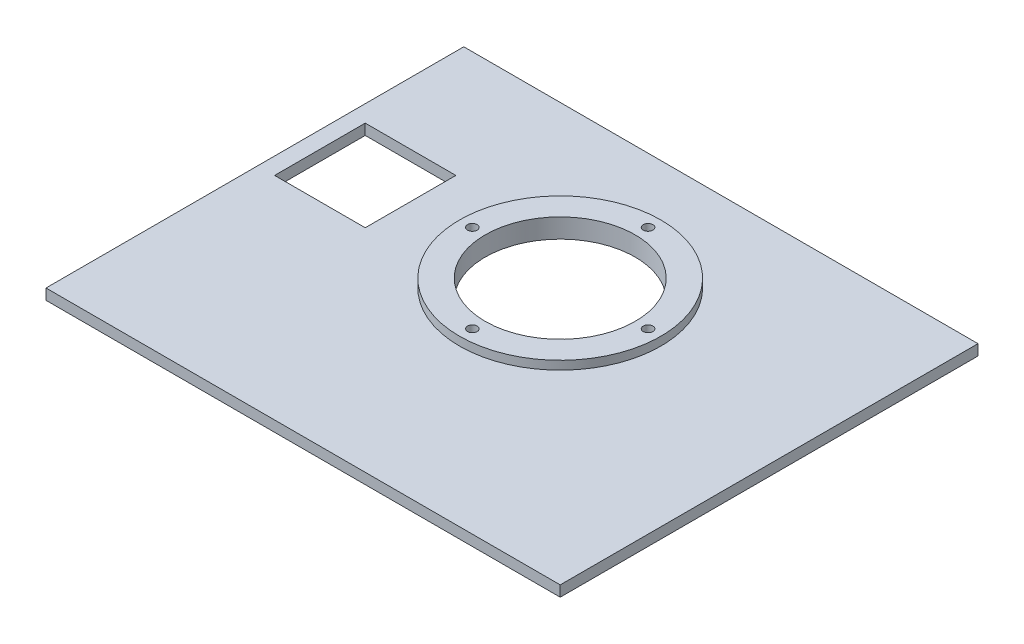
ISO-10303-21;
HEADER;
FILE_DESCRIPTION(('STEP AP214'),'2;1');
FILE_NAME('part.step','',(''),(''),'','','');
FILE_SCHEMA(('AUTOMOTIVE_DESIGN { 1 0 10303 214 1 1 1 1 }'));
ENDSEC;
DATA;
#1=APPLICATION_CONTEXT('core data for automotive mechanical design processes');
#2=APPLICATION_PROTOCOL_DEFINITION('international standard','automotive_design',2000,#1);
#3=PRODUCT_CONTEXT('',#1,'mechanical');
#4=PRODUCT('Part','Part','',(#3));
#5=PRODUCT_RELATED_PRODUCT_CATEGORY('part','',(#4));
#6=PRODUCT_DEFINITION_FORMATION('','',#4);
#7=PRODUCT_DEFINITION_CONTEXT('part definition',#1,'design');
#8=PRODUCT_DEFINITION('design','',#6,#7);
#9=PRODUCT_DEFINITION_SHAPE('','',#8);
#10=(LENGTH_UNIT() NAMED_UNIT(*) SI_UNIT(.MILLI.,.METRE.));
#11=(NAMED_UNIT(*) PLANE_ANGLE_UNIT() SI_UNIT($,.RADIAN.));
#12=(NAMED_UNIT(*) SI_UNIT($,.STERADIAN.) SOLID_ANGLE_UNIT());
#13=UNCERTAINTY_MEASURE_WITH_UNIT(LENGTH_MEASURE(1.E-05),#10,'distance_accuracy_value','');
#14=(GEOMETRIC_REPRESENTATION_CONTEXT(3) GLOBAL_UNCERTAINTY_ASSIGNED_CONTEXT((#13)) GLOBAL_UNIT_ASSIGNED_CONTEXT((#10,
#11,#12)) REPRESENTATION_CONTEXT('',''));
#15=CARTESIAN_POINT('',(0.,0.,0.));
#16=DIRECTION('',(0.,0.,1.));
#17=DIRECTION('',(1.,0.,0.));
#18=AXIS2_PLACEMENT_3D('',#15,#16,#17);
#19=CARTESIAN_POINT('',(0.,5.,0.));
#20=DIRECTION('',(0.,1.,0.));
#21=DIRECTION('',(0.,0.,1.));
#22=AXIS2_PLACEMENT_3D('',#19,#20,#21);
#23=PLANE('',#22);
#24=DIRECTION('',(0.,0.,-1.));
#25=VECTOR('',#24,1.);
#26=CARTESIAN_POINT('',(-69.85,5.,21.15));
#27=LINE('',#26,#25);
#28=CARTESIAN_POINT('',(-69.85,5.,21.15));
#29=VERTEX_POINT('',#28);
#30=CARTESIAN_POINT('',(-69.85,5.,-21.15));
#31=VERTEX_POINT('',#30);
#32=EDGE_CURVE('E55',#29,#31,#27,.T.);
#33=ORIENTED_EDGE('',*,*,#32,.F.);
#34=DIRECTION('',(1.,0.,0.));
#35=VECTOR('',#34,1.);
#36=CARTESIAN_POINT('',(-69.85,5.,21.15));
#37=LINE('',#36,#35);
#38=CARTESIAN_POINT('',(-112.15,5.,21.15));
#39=VERTEX_POINT('',#38);
#40=EDGE_CURVE('E123',#39,#29,#37,.T.);
#41=ORIENTED_EDGE('',*,*,#40,.F.);
#42=DIRECTION('',(0.,0.,1.));
#43=VECTOR('',#42,1.);
#44=CARTESIAN_POINT('',(-112.15,5.,21.15));
#45=LINE('',#44,#43);
#46=CARTESIAN_POINT('',(-112.15,5.,-21.15));
#47=VERTEX_POINT('',#46);
#48=EDGE_CURVE('E108',#47,#39,#45,.T.);
#49=ORIENTED_EDGE('',*,*,#48,.F.);
#50=DIRECTION('',(-1.,0.,0.));
#51=VECTOR('',#50,1.);
#52=CARTESIAN_POINT('',(-69.85,5.,-21.15));
#53=LINE('',#52,#51);
#54=EDGE_CURVE('E117',#31,#47,#53,.T.);
#55=ORIENTED_EDGE('',*,*,#54,.F.);
#56=EDGE_LOOP('',(#33,#41,#49,#55));
#57=FACE_BOUND('',#56,.T.);
#58=CARTESIAN_POINT('',(0.,5.,0.));
#59=DIRECTION('',(0.,1.,0.));
#60=DIRECTION('',(0.,0.,1.));
#61=AXIS2_PLACEMENT_3D('',#58,#59,#60);
#62=CIRCLE('',#61,47.);
#63=CARTESIAN_POINT('',(0.,5.,47.));
#64=VERTEX_POINT('',#63);
#65=EDGE_CURVE('E155',#64,#64,#62,.T.);
#66=ORIENTED_EDGE('',*,*,#65,.F.);
#67=EDGE_LOOP('',(#66));
#68=FACE_BOUND('',#67,.T.);
#69=DIRECTION('',(0.,0.,1.));
#70=VECTOR('',#69,1.);
#71=CARTESIAN_POINT('',(-120.,5.,-75.));
#72=LINE('',#71,#70);
#73=CARTESIAN_POINT('',(-120.,5.,-75.));
#74=VERTEX_POINT('',#73);
#75=CARTESIAN_POINT('',(-120.,5.,120.));
#76=VERTEX_POINT('',#75);
#77=EDGE_CURVE('E163',#74,#76,#72,.T.);
#78=ORIENTED_EDGE('',*,*,#77,.T.);
#79=DIRECTION('',(1.,0.,0.));
#80=VECTOR('',#79,1.);
#81=CARTESIAN_POINT('',(-120.,5.,120.));
#82=LINE('',#81,#80);
#83=CARTESIAN_POINT('',(120.,5.,120.));
#84=VERTEX_POINT('',#83);
#85=EDGE_CURVE('E166',#76,#84,#82,.T.);
#86=ORIENTED_EDGE('',*,*,#85,.T.);
#87=DIRECTION('',(0.,0.,-1.));
#88=VECTOR('',#87,1.);
#89=CARTESIAN_POINT('',(120.,5.,120.));
#90=LINE('',#89,#88);
#91=CARTESIAN_POINT('',(120.,5.,-75.));
#92=VERTEX_POINT('',#91);
#93=EDGE_CURVE('E169',#84,#92,#90,.T.);
#94=ORIENTED_EDGE('',*,*,#93,.T.);
#95=DIRECTION('',(-1.,0.,0.));
#96=VECTOR('',#95,1.);
#97=CARTESIAN_POINT('',(-120.,5.,-75.));
#98=LINE('',#97,#96);
#99=EDGE_CURVE('E171',#92,#74,#98,.T.);
#100=ORIENTED_EDGE('',*,*,#99,.T.);
#101=EDGE_LOOP('',(#78,#86,#94,#100));
#102=FACE_BOUND('',#101,.T.);
#103=ADVANCED_FACE('F40',(#57,#68,#102),#23,.T.);
#104=CARTESIAN_POINT('',(0.,0.,0.));
#105=DIRECTION('',(0.,1.,0.));
#106=DIRECTION('',(0.,0.,1.));
#107=AXIS2_PLACEMENT_3D('',#104,#105,#106);
#108=PLANE('',#107);
#109=DIRECTION('',(1.,0.,0.));
#110=VECTOR('',#109,1.);
#111=CARTESIAN_POINT('',(0.,0.,21.15));
#112=LINE('',#111,#110);
#113=CARTESIAN_POINT('',(-112.15,0.,21.15));
#114=VERTEX_POINT('',#113);
#115=CARTESIAN_POINT('',(-69.85,0.,21.15));
#116=VERTEX_POINT('',#115);
#117=EDGE_CURVE('E48',#114,#116,#112,.T.);
#118=ORIENTED_EDGE('',*,*,#117,.T.);
#119=DIRECTION('',(0.,0.,-1.));
#120=VECTOR('',#119,1.);
#121=CARTESIAN_POINT('',(-69.85,0.,0.));
#122=LINE('',#121,#120);
#123=CARTESIAN_POINT('',(-69.85,0.,-21.15));
#124=VERTEX_POINT('',#123);
#125=EDGE_CURVE('E11',#116,#124,#122,.T.);
#126=ORIENTED_EDGE('',*,*,#125,.T.);
#127=DIRECTION('',(-1.,0.,0.));
#128=VECTOR('',#127,1.);
#129=CARTESIAN_POINT('',(0.,0.,-21.15));
#130=LINE('',#129,#128);
#131=CARTESIAN_POINT('',(-112.15,0.,-21.15));
#132=VERTEX_POINT('',#131);
#133=EDGE_CURVE('E158',#124,#132,#130,.T.);
#134=ORIENTED_EDGE('',*,*,#133,.T.);
#135=DIRECTION('',(0.,0.,1.));
#136=VECTOR('',#135,1.);
#137=CARTESIAN_POINT('',(-112.15,0.,0.));
#138=LINE('',#137,#136);
#139=EDGE_CURVE('E111',#132,#114,#138,.T.);
#140=ORIENTED_EDGE('',*,*,#139,.T.);
#141=EDGE_LOOP('',(#118,#126,#134,#140));
#142=FACE_BOUND('',#141,.T.);
#143=CARTESIAN_POINT('',(0.,0.,-41.));
#144=DIRECTION('',(0.,-1.,0.));
#145=DIRECTION('',(0.,0.,-1.));
#146=AXIS2_PLACEMENT_3D('',#143,#144,#145);
#147=CIRCLE('',#146,2.25);
#148=CARTESIAN_POINT('',(0.,0.,-43.25));
#149=VERTEX_POINT('',#148);
#150=EDGE_CURVE('E130',#149,#149,#147,.T.);
#151=ORIENTED_EDGE('',*,*,#150,.F.);
#152=EDGE_LOOP('',(#151));
#153=FACE_BOUND('',#152,.T.);
#154=CARTESIAN_POINT('',(-41.,0.,0.));
#155=DIRECTION('',(0.,-1.,0.));
#156=DIRECTION('',(0.,0.,-1.));
#157=AXIS2_PLACEMENT_3D('',#154,#155,#156);
#158=CIRCLE('',#157,2.25);
#159=CARTESIAN_POINT('',(-41.,0.,-2.25));
#160=VERTEX_POINT('',#159);
#161=EDGE_CURVE('E136',#160,#160,#158,.T.);
#162=ORIENTED_EDGE('',*,*,#161,.F.);
#163=EDGE_LOOP('',(#162));
#164=FACE_BOUND('',#163,.T.);
#165=CARTESIAN_POINT('',(0.,0.,41.));
#166=DIRECTION('',(0.,-1.,0.));
#167=DIRECTION('',(0.,0.,-1.));
#168=AXIS2_PLACEMENT_3D('',#165,#166,#167);
#169=CIRCLE('',#168,2.25);
#170=CARTESIAN_POINT('',(0.,0.,38.75));
#171=VERTEX_POINT('',#170);
#172=EDGE_CURVE('E140',#171,#171,#169,.T.);
#173=ORIENTED_EDGE('',*,*,#172,.F.);
#174=EDGE_LOOP('',(#173));
#175=FACE_BOUND('',#174,.T.);
#176=CARTESIAN_POINT('',(41.,0.,0.));
#177=DIRECTION('',(0.,-1.,0.));
#178=DIRECTION('',(0.,0.,-1.));
#179=AXIS2_PLACEMENT_3D('',#176,#177,#178);
#180=CIRCLE('',#179,2.25);
#181=CARTESIAN_POINT('',(41.,0.,-2.25));
#182=VERTEX_POINT('',#181);
#183=EDGE_CURVE('E144',#182,#182,#180,.T.);
#184=ORIENTED_EDGE('',*,*,#183,.F.);
#185=EDGE_LOOP('',(#184));
#186=FACE_BOUND('',#185,.T.);
#187=DIRECTION('',(0.,0.,1.));
#188=VECTOR('',#187,1.);
#189=CARTESIAN_POINT('',(-120.,0.,-75.));
#190=LINE('',#189,#188);
#191=CARTESIAN_POINT('',(-120.,0.,-75.));
#192=VERTEX_POINT('',#191);
#193=CARTESIAN_POINT('',(-120.,0.,120.));
#194=VERTEX_POINT('',#193);
#195=EDGE_CURVE('E162',#192,#194,#190,.T.);
#196=ORIENTED_EDGE('',*,*,#195,.F.);
#197=DIRECTION('',(-1.,0.,0.));
#198=VECTOR('',#197,1.);
#199=CARTESIAN_POINT('',(-120.,0.,-75.));
#200=LINE('',#199,#198);
#201=CARTESIAN_POINT('',(120.,0.,-75.));
#202=VERTEX_POINT('',#201);
#203=EDGE_CURVE('E167',#202,#192,#200,.T.);
#204=ORIENTED_EDGE('',*,*,#203,.F.);
#205=DIRECTION('',(0.,0.,-1.));
#206=VECTOR('',#205,1.);
#207=CARTESIAN_POINT('',(120.,0.,120.));
#208=LINE('',#207,#206);
#209=CARTESIAN_POINT('',(120.,0.,120.));
#210=VERTEX_POINT('',#209);
#211=EDGE_CURVE('E178',#210,#202,#208,.T.);
#212=ORIENTED_EDGE('',*,*,#211,.F.);
#213=DIRECTION('',(1.,0.,0.));
#214=VECTOR('',#213,1.);
#215=CARTESIAN_POINT('',(-120.,0.,120.));
#216=LINE('',#215,#214);
#217=EDGE_CURVE('E176',#194,#210,#216,.T.);
#218=ORIENTED_EDGE('',*,*,#217,.F.);
#219=EDGE_LOOP('',(#196,#204,#212,#218));
#220=FACE_BOUND('',#219,.T.);
#221=CARTESIAN_POINT('',(0.,0.,0.));
#222=DIRECTION('',(0.,1.,0.));
#223=DIRECTION('',(0.,0.,1.));
#224=AXIS2_PLACEMENT_3D('',#221,#222,#223);
#225=CIRCLE('',#224,35.);
#226=CARTESIAN_POINT('',(0.,0.,35.));
#227=VERTEX_POINT('',#226);
#228=EDGE_CURVE('E154',#227,#227,#225,.T.);
#229=ORIENTED_EDGE('',*,*,#228,.T.);
#230=EDGE_LOOP('',(#229));
#231=FACE_BOUND('',#230,.T.);
#232=ADVANCED_FACE('F202',(#142,#153,#164,#175,#186,#220,#231),#108,.F.);
#233=CARTESIAN_POINT('',(-120.,5.,-75.));
#234=DIRECTION('',(1.,0.,0.));
#235=DIRECTION('',(0.,0.,-1.));
#236=AXIS2_PLACEMENT_3D('',#233,#234,#235);
#237=PLANE('',#236);
#238=ORIENTED_EDGE('',*,*,#195,.T.);
#239=DIRECTION('',(0.,-1.,0.));
#240=VECTOR('',#239,1.);
#241=CARTESIAN_POINT('',(-120.,5.,120.));
#242=LINE('',#241,#240);
#243=EDGE_CURVE('E159',#76,#194,#242,.T.);
#244=ORIENTED_EDGE('',*,*,#243,.F.);
#245=ORIENTED_EDGE('',*,*,#77,.F.);
#246=DIRECTION('',(0.,-1.,0.));
#247=VECTOR('',#246,1.);
#248=CARTESIAN_POINT('',(-120.,5.,-75.));
#249=LINE('',#248,#247);
#250=EDGE_CURVE('E173',#74,#192,#249,.T.);
#251=ORIENTED_EDGE('',*,*,#250,.T.);
#252=EDGE_LOOP('',(#238,#244,#245,#251));
#253=FACE_BOUND('',#252,.T.);
#254=ADVANCED_FACE('F42',(#253),#237,.F.);
#255=CARTESIAN_POINT('',(-120.,5.,120.));
#256=DIRECTION('',(0.,0.,-1.));
#257=DIRECTION('',(-1.,0.,0.));
#258=AXIS2_PLACEMENT_3D('',#255,#256,#257);
#259=PLANE('',#258);
#260=ORIENTED_EDGE('',*,*,#217,.T.);
#261=DIRECTION('',(0.,-1.,0.));
#262=VECTOR('',#261,1.);
#263=CARTESIAN_POINT('',(120.,5.,120.));
#264=LINE('',#263,#262);
#265=EDGE_CURVE('E186',#84,#210,#264,.T.);
#266=ORIENTED_EDGE('',*,*,#265,.F.);
#267=ORIENTED_EDGE('',*,*,#85,.F.);
#268=ORIENTED_EDGE('',*,*,#243,.T.);
#269=EDGE_LOOP('',(#260,#266,#267,#268));
#270=FACE_BOUND('',#269,.T.);
#271=ADVANCED_FACE('F236',(#270),#259,.F.);
#272=CARTESIAN_POINT('',(120.,5.,120.));
#273=DIRECTION('',(-1.,0.,0.));
#274=DIRECTION('',(0.,0.,1.));
#275=AXIS2_PLACEMENT_3D('',#272,#273,#274);
#276=PLANE('',#275);
#277=ORIENTED_EDGE('',*,*,#211,.T.);
#278=DIRECTION('',(0.,-1.,0.));
#279=VECTOR('',#278,1.);
#280=CARTESIAN_POINT('',(120.,5.,-75.));
#281=LINE('',#280,#279);
#282=EDGE_CURVE('E183',#92,#202,#281,.T.);
#283=ORIENTED_EDGE('',*,*,#282,.F.);
#284=ORIENTED_EDGE('',*,*,#93,.F.);
#285=ORIENTED_EDGE('',*,*,#265,.T.);
#286=EDGE_LOOP('',(#277,#283,#284,#285));
#287=FACE_BOUND('',#286,.T.);
#288=ADVANCED_FACE('F233',(#287),#276,.F.);
#289=CARTESIAN_POINT('',(-120.,5.,-75.));
#290=DIRECTION('',(0.,0.,1.));
#291=DIRECTION('',(1.,0.,0.));
#292=AXIS2_PLACEMENT_3D('',#289,#290,#291);
#293=PLANE('',#292);
#294=ORIENTED_EDGE('',*,*,#203,.T.);
#295=ORIENTED_EDGE('',*,*,#250,.F.);
#296=ORIENTED_EDGE('',*,*,#99,.F.);
#297=ORIENTED_EDGE('',*,*,#282,.T.);
#298=EDGE_LOOP('',(#294,#295,#296,#297));
#299=FACE_BOUND('',#298,.T.);
#300=ADVANCED_FACE('F230',(#299),#293,.F.);
#301=CARTESIAN_POINT('',(0.,5.,0.));
#302=DIRECTION('',(0.,-1.,0.));
#303=DIRECTION('',(0.,0.,-1.));
#304=AXIS2_PLACEMENT_3D('',#301,#302,#303);
#305=CYLINDRICAL_SURFACE('',#304,35.);
#306=ORIENTED_EDGE('',*,*,#228,.F.);
#307=EDGE_LOOP('',(#306));
#308=FACE_BOUND('',#307,.T.);
#309=CARTESIAN_POINT('',(0.,9.,0.));
#310=DIRECTION('',(0.,1.,0.));
#311=DIRECTION('',(0.,0.,1.));
#312=AXIS2_PLACEMENT_3D('',#309,#310,#311);
#313=CIRCLE('',#312,35.);
#314=CARTESIAN_POINT('',(0.,9.,35.));
#315=VERTEX_POINT('',#314);
#316=EDGE_CURVE('E148',#315,#315,#313,.T.);
#317=ORIENTED_EDGE('',*,*,#316,.T.);
#318=EDGE_LOOP('',(#317));
#319=FACE_BOUND('',#318,.T.);
#320=ADVANCED_FACE('F227',(#308,#319),#305,.F.);
#321=CARTESIAN_POINT('',(0.,9.,0.));
#322=DIRECTION('',(0.,1.,0.));
#323=DIRECTION('',(0.,0.,1.));
#324=AXIS2_PLACEMENT_3D('',#321,#322,#323);
#325=PLANE('',#324);
#326=CARTESIAN_POINT('',(0.,9.,-41.));
#327=DIRECTION('',(0.,1.,0.));
#328=DIRECTION('',(0.,0.,1.));
#329=AXIS2_PLACEMENT_3D('',#326,#327,#328);
#330=CIRCLE('',#329,2.25);
#331=CARTESIAN_POINT('',(0.,9.,-38.75));
#332=VERTEX_POINT('',#331);
#333=EDGE_CURVE('E135',#332,#332,#330,.T.);
#334=ORIENTED_EDGE('',*,*,#333,.F.);
#335=EDGE_LOOP('',(#334));
#336=FACE_BOUND('',#335,.T.);
#337=CARTESIAN_POINT('',(-41.,9.,0.));
#338=DIRECTION('',(0.,1.,0.));
#339=DIRECTION('',(0.,0.,1.));
#340=AXIS2_PLACEMENT_3D('',#337,#338,#339);
#341=CIRCLE('',#340,2.25);
#342=CARTESIAN_POINT('',(-41.,9.,2.25));
#343=VERTEX_POINT('',#342);
#344=EDGE_CURVE('E139',#343,#343,#341,.T.);
#345=ORIENTED_EDGE('',*,*,#344,.F.);
#346=EDGE_LOOP('',(#345));
#347=FACE_BOUND('',#346,.T.);
#348=CARTESIAN_POINT('',(0.,9.,41.));
#349=DIRECTION('',(0.,1.,0.));
#350=DIRECTION('',(0.,0.,1.));
#351=AXIS2_PLACEMENT_3D('',#348,#349,#350);
#352=CIRCLE('',#351,2.25);
#353=CARTESIAN_POINT('',(0.,9.,43.25));
#354=VERTEX_POINT('',#353);
#355=EDGE_CURVE('E143',#354,#354,#352,.T.);
#356=ORIENTED_EDGE('',*,*,#355,.F.);
#357=EDGE_LOOP('',(#356));
#358=FACE_BOUND('',#357,.T.);
#359=CARTESIAN_POINT('',(41.,9.,0.));
#360=DIRECTION('',(0.,1.,0.));
#361=DIRECTION('',(0.,0.,1.));
#362=AXIS2_PLACEMENT_3D('',#359,#360,#361);
#363=CIRCLE('',#362,2.25);
#364=CARTESIAN_POINT('',(41.,9.,2.25));
#365=VERTEX_POINT('',#364);
#366=EDGE_CURVE('E147',#365,#365,#363,.T.);
#367=ORIENTED_EDGE('',*,*,#366,.F.);
#368=EDGE_LOOP('',(#367));
#369=FACE_BOUND('',#368,.T.);
#370=CARTESIAN_POINT('',(0.,9.,0.));
#371=DIRECTION('',(0.,1.,0.));
#372=DIRECTION('',(0.,0.,1.));
#373=AXIS2_PLACEMENT_3D('',#370,#371,#372);
#374=CIRCLE('',#373,47.);
#375=CARTESIAN_POINT('',(0.,9.,47.));
#376=VERTEX_POINT('',#375);
#377=EDGE_CURVE('E151',#376,#376,#374,.T.);
#378=ORIENTED_EDGE('',*,*,#377,.T.);
#379=EDGE_LOOP('',(#378));
#380=FACE_BOUND('',#379,.T.);
#381=ORIENTED_EDGE('',*,*,#316,.F.);
#382=EDGE_LOOP('',(#381));
#383=FACE_BOUND('',#382,.T.);
#384=ADVANCED_FACE('F261',(#336,#347,#358,#369,#380,#383),#325,.T.);
#385=CARTESIAN_POINT('',(0.,9.,0.));
#386=DIRECTION('',(0.,-1.,0.));
#387=DIRECTION('',(0.,0.,-1.));
#388=AXIS2_PLACEMENT_3D('',#385,#386,#387);
#389=CYLINDRICAL_SURFACE('',#388,47.);
#390=ORIENTED_EDGE('',*,*,#377,.F.);
#391=EDGE_LOOP('',(#390));
#392=FACE_BOUND('',#391,.T.);
#393=ORIENTED_EDGE('',*,*,#65,.T.);
#394=EDGE_LOOP('',(#393));
#395=FACE_BOUND('',#394,.T.);
#396=ADVANCED_FACE('F265',(#392,#395),#389,.T.);
#397=CARTESIAN_POINT('',(41.,0.,0.));
#398=DIRECTION('',(0.,-1.,0.));
#399=DIRECTION('',(0.,0.,-1.));
#400=AXIS2_PLACEMENT_3D('',#397,#398,#399);
#401=CYLINDRICAL_SURFACE('',#400,2.25);
#402=ORIENTED_EDGE('',*,*,#366,.T.);
#403=EDGE_LOOP('',(#402));
#404=FACE_BOUND('',#403,.T.);
#405=ORIENTED_EDGE('',*,*,#183,.T.);
#406=EDGE_LOOP('',(#405));
#407=FACE_BOUND('',#406,.T.);
#408=ADVANCED_FACE('F271',(#404,#407),#401,.F.);
#409=CARTESIAN_POINT('',(0.,0.,41.));
#410=DIRECTION('',(0.,-1.,0.));
#411=DIRECTION('',(0.,0.,-1.));
#412=AXIS2_PLACEMENT_3D('',#409,#410,#411);
#413=CYLINDRICAL_SURFACE('',#412,2.25);
#414=ORIENTED_EDGE('',*,*,#355,.T.);
#415=EDGE_LOOP('',(#414));
#416=FACE_BOUND('',#415,.T.);
#417=ORIENTED_EDGE('',*,*,#172,.T.);
#418=EDGE_LOOP('',(#417));
#419=FACE_BOUND('',#418,.T.);
#420=ADVANCED_FACE('F278',(#416,#419),#413,.F.);
#421=CARTESIAN_POINT('',(-41.,0.,0.));
#422=DIRECTION('',(0.,-1.,0.));
#423=DIRECTION('',(0.,0.,-1.));
#424=AXIS2_PLACEMENT_3D('',#421,#422,#423);
#425=CYLINDRICAL_SURFACE('',#424,2.25);
#426=ORIENTED_EDGE('',*,*,#344,.T.);
#427=EDGE_LOOP('',(#426));
#428=FACE_BOUND('',#427,.T.);
#429=ORIENTED_EDGE('',*,*,#161,.T.);
#430=EDGE_LOOP('',(#429));
#431=FACE_BOUND('',#430,.T.);
#432=ADVANCED_FACE('F216',(#428,#431),#425,.F.);
#433=CARTESIAN_POINT('',(0.,0.,-41.));
#434=DIRECTION('',(0.,-1.,0.));
#435=DIRECTION('',(0.,0.,-1.));
#436=AXIS2_PLACEMENT_3D('',#433,#434,#435);
#437=CYLINDRICAL_SURFACE('',#436,2.25);
#438=ORIENTED_EDGE('',*,*,#333,.T.);
#439=EDGE_LOOP('',(#438));
#440=FACE_BOUND('',#439,.T.);
#441=ORIENTED_EDGE('',*,*,#150,.T.);
#442=EDGE_LOOP('',(#441));
#443=FACE_BOUND('',#442,.T.);
#444=ADVANCED_FACE('F209',(#440,#443),#437,.F.);
#445=CARTESIAN_POINT('',(-69.85,-9.,21.15));
#446=DIRECTION('',(1.,0.,0.));
#447=DIRECTION('',(0.,0.,-1.));
#448=AXIS2_PLACEMENT_3D('',#445,#446,#447);
#449=PLANE('',#448);
#450=DIRECTION('',(0.,1.,0.));
#451=VECTOR('',#450,1.);
#452=CARTESIAN_POINT('',(-69.85,-9.,21.15));
#453=LINE('',#452,#451);
#454=EDGE_CURVE('E128',#116,#29,#453,.T.);
#455=ORIENTED_EDGE('',*,*,#454,.T.);
#456=ORIENTED_EDGE('',*,*,#32,.T.);
#457=DIRECTION('',(0.,1.,0.));
#458=VECTOR('',#457,1.);
#459=CARTESIAN_POINT('',(-69.85,-9.,-21.15));
#460=LINE('',#459,#458);
#461=EDGE_CURVE('E114',#124,#31,#460,.T.);
#462=ORIENTED_EDGE('',*,*,#461,.F.);
#463=ORIENTED_EDGE('',*,*,#125,.F.);
#464=EDGE_LOOP('',(#455,#456,#462,#463));
#465=FACE_BOUND('',#464,.T.);
#466=ADVANCED_FACE('F207',(#465),#449,.F.);
#467=CARTESIAN_POINT('',(-69.85,-9.,21.15));
#468=DIRECTION('',(0.,0.,1.));
#469=DIRECTION('',(1.,0.,0.));
#470=AXIS2_PLACEMENT_3D('',#467,#468,#469);
#471=PLANE('',#470);
#472=DIRECTION('',(0.,1.,0.));
#473=VECTOR('',#472,1.);
#474=CARTESIAN_POINT('',(-112.15,-9.,21.15));
#475=LINE('',#474,#473);
#476=EDGE_CURVE('E113',#114,#39,#475,.T.);
#477=ORIENTED_EDGE('',*,*,#476,.T.);
#478=ORIENTED_EDGE('',*,*,#40,.T.);
#479=ORIENTED_EDGE('',*,*,#454,.F.);
#480=ORIENTED_EDGE('',*,*,#117,.F.);
#481=EDGE_LOOP('',(#477,#478,#479,#480));
#482=FACE_BOUND('',#481,.T.);
#483=ADVANCED_FACE('F206',(#482),#471,.F.);
#484=CARTESIAN_POINT('',(-112.15,-9.,21.15));
#485=DIRECTION('',(-1.,0.,0.));
#486=DIRECTION('',(0.,0.,1.));
#487=AXIS2_PLACEMENT_3D('',#484,#485,#486);
#488=PLANE('',#487);
#489=DIRECTION('',(0.,1.,0.));
#490=VECTOR('',#489,1.);
#491=CARTESIAN_POINT('',(-112.15,-9.,-21.15));
#492=LINE('',#491,#490);
#493=EDGE_CURVE('E63',#132,#47,#492,.T.);
#494=ORIENTED_EDGE('',*,*,#493,.T.);
#495=ORIENTED_EDGE('',*,*,#48,.T.);
#496=ORIENTED_EDGE('',*,*,#476,.F.);
#497=ORIENTED_EDGE('',*,*,#139,.F.);
#498=EDGE_LOOP('',(#494,#495,#496,#497));
#499=FACE_BOUND('',#498,.T.);
#500=ADVANCED_FACE('F105',(#499),#488,.F.);
#501=CARTESIAN_POINT('',(-69.85,-9.,-21.15));
#502=DIRECTION('',(0.,0.,-1.));
#503=DIRECTION('',(-1.,0.,0.));
#504=AXIS2_PLACEMENT_3D('',#501,#502,#503);
#505=PLANE('',#504);
#506=ORIENTED_EDGE('',*,*,#461,.T.);
#507=ORIENTED_EDGE('',*,*,#54,.T.);
#508=ORIENTED_EDGE('',*,*,#493,.F.);
#509=ORIENTED_EDGE('',*,*,#133,.F.);
#510=EDGE_LOOP('',(#506,#507,#508,#509));
#511=FACE_BOUND('',#510,.T.);
#512=ADVANCED_FACE('F118',(#511),#505,.F.);
#513=CLOSED_SHELL('',(#103,#232,#254,#271,#288,#300,#320,#384,#396,#408,#420,#432,#444,#466,
#483,#500,#512));
#514=MANIFOLD_SOLID_BREP('B2',#513);
#515=ADVANCED_BREP_SHAPE_REPRESENTATION('',(#18,#514),#14);
#516=SHAPE_DEFINITION_REPRESENTATION(#9,#515);
ENDSEC;
END-ISO-10303-21;
